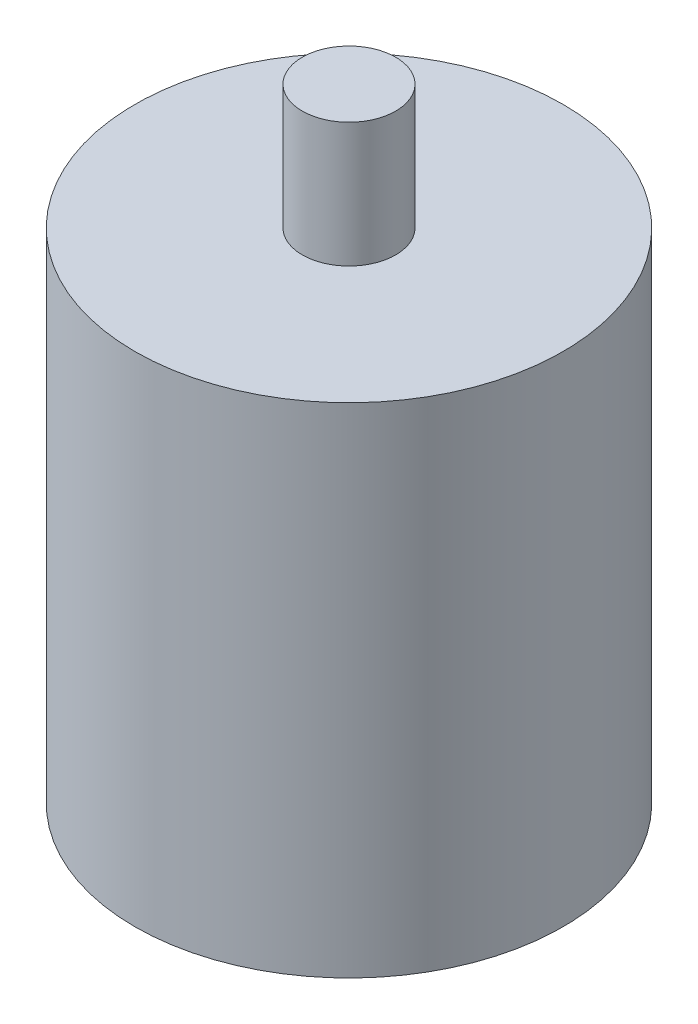
ISO-10303-21;
HEADER;
FILE_DESCRIPTION(('STEP AP214'),'2;1');
FILE_NAME('part.step','',(''),(''),'','','');
FILE_SCHEMA(('AUTOMOTIVE_DESIGN { 1 0 10303 214 1 1 1 1 }'));
ENDSEC;
DATA;
#1=APPLICATION_CONTEXT('core data for automotive mechanical design processes');
#2=APPLICATION_PROTOCOL_DEFINITION('international standard','automotive_design',2000,#1);
#3=PRODUCT_CONTEXT('',#1,'mechanical');
#4=PRODUCT('Part','Part','',(#3));
#5=PRODUCT_RELATED_PRODUCT_CATEGORY('part','',(#4));
#6=PRODUCT_DEFINITION_FORMATION('','',#4);
#7=PRODUCT_DEFINITION_CONTEXT('part definition',#1,'design');
#8=PRODUCT_DEFINITION('design','',#6,#7);
#9=PRODUCT_DEFINITION_SHAPE('','',#8);
#10=(LENGTH_UNIT() NAMED_UNIT(*) SI_UNIT(.MILLI.,.METRE.));
#11=(NAMED_UNIT(*) PLANE_ANGLE_UNIT() SI_UNIT($,.RADIAN.));
#12=(NAMED_UNIT(*) SI_UNIT($,.STERADIAN.) SOLID_ANGLE_UNIT());
#13=UNCERTAINTY_MEASURE_WITH_UNIT(LENGTH_MEASURE(1.E-05),#10,'distance_accuracy_value','');
#14=(GEOMETRIC_REPRESENTATION_CONTEXT(3) GLOBAL_UNCERTAINTY_ASSIGNED_CONTEXT((#13)) GLOBAL_UNIT_ASSIGNED_CONTEXT((#10,
#11,#12)) REPRESENTATION_CONTEXT('',''));
#15=CARTESIAN_POINT('',(0.,0.,0.));
#16=DIRECTION('',(0.,0.,1.));
#17=DIRECTION('',(1.,0.,0.));
#18=AXIS2_PLACEMENT_3D('',#15,#16,#17);
#19=CARTESIAN_POINT('',(0.,32.,0.));
#20=DIRECTION('',(0.,-1.,0.));
#21=DIRECTION('',(0.,0.,-1.));
#22=AXIS2_PLACEMENT_3D('',#19,#20,#21);
#23=CYLINDRICAL_SURFACE('',#22,13.75);
#24=CARTESIAN_POINT('',(0.,32.,0.));
#25=DIRECTION('',(0.,1.,0.));
#26=DIRECTION('',(0.,0.,1.));
#27=AXIS2_PLACEMENT_3D('',#24,#25,#26);
#28=CIRCLE('',#27,13.75);
#29=CARTESIAN_POINT('',(0.,32.,13.75));
#30=VERTEX_POINT('',#29);
#31=EDGE_CURVE('E45',#30,#30,#28,.T.);
#32=ORIENTED_EDGE('',*,*,#31,.F.);
#33=EDGE_LOOP('',(#32));
#34=FACE_BOUND('',#33,.T.);
#35=CARTESIAN_POINT('',(0.,0.,0.));
#36=DIRECTION('',(0.,1.,0.));
#37=DIRECTION('',(0.,0.,1.));
#38=AXIS2_PLACEMENT_3D('',#35,#36,#37);
#39=CIRCLE('',#38,13.75);
#40=CARTESIAN_POINT('',(0.,0.,13.75));
#41=VERTEX_POINT('',#40);
#42=EDGE_CURVE('E40',#41,#41,#39,.T.);
#43=ORIENTED_EDGE('',*,*,#42,.T.);
#44=EDGE_LOOP('',(#43));
#45=FACE_BOUND('',#44,.T.);
#46=ADVANCED_FACE('F37',(#34,#45),#23,.T.);
#47=CARTESIAN_POINT('',(0.,32.,0.));
#48=DIRECTION('',(0.,1.,0.));
#49=DIRECTION('',(0.,0.,1.));
#50=AXIS2_PLACEMENT_3D('',#47,#48,#49);
#51=PLANE('',#50);
#52=CARTESIAN_POINT('',(0.,32.,0.));
#53=DIRECTION('',(0.,1.,0.));
#54=DIRECTION('',(0.,0.,1.));
#55=AXIS2_PLACEMENT_3D('',#52,#53,#54);
#56=CIRCLE('',#55,3.);
#57=CARTESIAN_POINT('',(0.,32.,3.));
#58=VERTEX_POINT('',#57);
#59=EDGE_CURVE('E10',#58,#58,#56,.T.);
#60=ORIENTED_EDGE('',*,*,#59,.F.);
#61=EDGE_LOOP('',(#60));
#62=FACE_BOUND('',#61,.T.);
#63=ORIENTED_EDGE('',*,*,#31,.T.);
#64=EDGE_LOOP('',(#63));
#65=FACE_BOUND('',#64,.T.);
#66=ADVANCED_FACE('F65',(#62,#65),#51,.T.);
#67=CARTESIAN_POINT('',(0.,0.,0.));
#68=DIRECTION('',(0.,1.,0.));
#69=DIRECTION('',(0.,0.,1.));
#70=AXIS2_PLACEMENT_3D('',#67,#68,#69);
#71=PLANE('',#70);
#72=ORIENTED_EDGE('',*,*,#42,.F.);
#73=EDGE_LOOP('',(#72));
#74=FACE_BOUND('',#73,.T.);
#75=ADVANCED_FACE('F62',(#74),#71,.F.);
#76=CARTESIAN_POINT('',(0.,40.,0.));
#77=DIRECTION('',(0.,-1.,0.));
#78=DIRECTION('',(0.,0.,-1.));
#79=AXIS2_PLACEMENT_3D('',#76,#77,#78);
#80=CYLINDRICAL_SURFACE('',#79,3.);
#81=CARTESIAN_POINT('',(0.,40.,0.));
#82=DIRECTION('',(0.,1.,0.));
#83=DIRECTION('',(0.,0.,1.));
#84=AXIS2_PLACEMENT_3D('',#81,#82,#83);
#85=CIRCLE('',#84,3.);
#86=CARTESIAN_POINT('',(0.,40.,3.));
#87=VERTEX_POINT('',#86);
#88=EDGE_CURVE('E52',#87,#87,#85,.T.);
#89=ORIENTED_EDGE('',*,*,#88,.F.);
#90=EDGE_LOOP('',(#89));
#91=FACE_BOUND('',#90,.T.);
#92=ORIENTED_EDGE('',*,*,#59,.T.);
#93=EDGE_LOOP('',(#92));
#94=FACE_BOUND('',#93,.T.);
#95=ADVANCED_FACE('F64',(#91,#94),#80,.T.);
#96=CARTESIAN_POINT('',(0.,40.,0.));
#97=DIRECTION('',(0.,1.,0.));
#98=DIRECTION('',(0.,0.,1.));
#99=AXIS2_PLACEMENT_3D('',#96,#97,#98);
#100=PLANE('',#99);
#101=ORIENTED_EDGE('',*,*,#88,.T.);
#102=EDGE_LOOP('',(#101));
#103=FACE_BOUND('',#102,.T.);
#104=ADVANCED_FACE('F70',(#103),#100,.T.);
#105=CLOSED_SHELL('',(#46,#66,#75,#95,#104));
#106=MANIFOLD_SOLID_BREP('B2',#105);
#107=ADVANCED_BREP_SHAPE_REPRESENTATION('',(#18,#106),#14);
#108=SHAPE_DEFINITION_REPRESENTATION(#9,#107);
ENDSEC;
END-ISO-10303-21;
